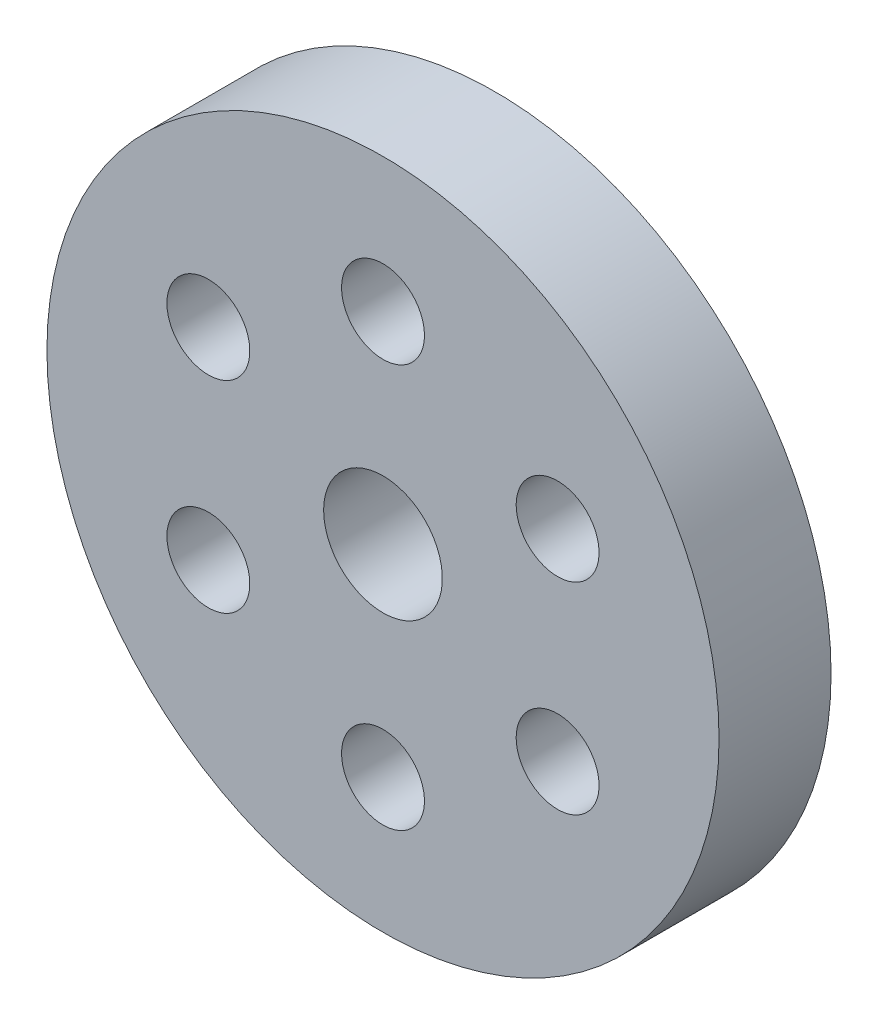
ISO-10303-21;
HEADER;
FILE_DESCRIPTION(('STEP AP214'),'2;1');
FILE_NAME('part.step','',(''),(''),'','','');
FILE_SCHEMA(('AUTOMOTIVE_DESIGN { 1 0 10303 214 1 1 1 1 }'));
ENDSEC;
DATA;
#1=APPLICATION_CONTEXT('core data for automotive mechanical design processes');
#2=APPLICATION_PROTOCOL_DEFINITION('international standard','automotive_design',2000,#1);
#3=PRODUCT_CONTEXT('',#1,'mechanical');
#4=PRODUCT('Part','Part','',(#3));
#5=PRODUCT_RELATED_PRODUCT_CATEGORY('part','',(#4));
#6=PRODUCT_DEFINITION_FORMATION('','',#4);
#7=PRODUCT_DEFINITION_CONTEXT('part definition',#1,'design');
#8=PRODUCT_DEFINITION('design','',#6,#7);
#9=PRODUCT_DEFINITION_SHAPE('','',#8);
#10=(LENGTH_UNIT() NAMED_UNIT(*) SI_UNIT(.MILLI.,.METRE.));
#11=(NAMED_UNIT(*) PLANE_ANGLE_UNIT() SI_UNIT($,.RADIAN.));
#12=(NAMED_UNIT(*) SI_UNIT($,.STERADIAN.) SOLID_ANGLE_UNIT());
#13=UNCERTAINTY_MEASURE_WITH_UNIT(LENGTH_MEASURE(1.E-05),#10,'distance_accuracy_value','');
#14=(GEOMETRIC_REPRESENTATION_CONTEXT(3) GLOBAL_UNCERTAINTY_ASSIGNED_CONTEXT((#13)) GLOBAL_UNIT_ASSIGNED_CONTEXT((#10,
#11,#12)) REPRESENTATION_CONTEXT('',''));
#15=CARTESIAN_POINT('',(0.,0.,0.));
#16=DIRECTION('',(0.,0.,1.));
#17=DIRECTION('',(1.,0.,0.));
#18=AXIS2_PLACEMENT_3D('',#15,#16,#17);
#19=CARTESIAN_POINT('',(0.,0.,0.));
#20=DIRECTION('',(0.,0.,1.));
#21=DIRECTION('',(1.,0.,0.));
#22=AXIS2_PLACEMENT_3D('',#19,#20,#21);
#23=PLANE('',#22);
#24=CARTESIAN_POINT('',(0.,-9.,0.));
#25=DIRECTION('',(0.,0.,-1.));
#26=DIRECTION('',(-1.,0.,0.));
#27=AXIS2_PLACEMENT_3D('',#24,#25,#26);
#28=CIRCLE('',#27,1.85);
#29=CARTESIAN_POINT('',(-1.85,-9.,0.));
#30=VERTEX_POINT('',#29);
#31=EDGE_CURVE('E71',#30,#30,#28,.T.);
#32=ORIENTED_EDGE('',*,*,#31,.F.);
#33=EDGE_LOOP('',(#32));
#34=FACE_BOUND('',#33,.T.);
#35=CARTESIAN_POINT('',(7.79422863405993,-4.50000000000004,0.));
#36=DIRECTION('',(0.,0.,-1.));
#37=DIRECTION('',(-1.,0.,0.));
#38=AXIS2_PLACEMENT_3D('',#35,#36,#37);
#39=CIRCLE('',#38,1.85);
#40=CARTESIAN_POINT('',(5.94422863405993,-4.50000000000004,0.));
#41=VERTEX_POINT('',#40);
#42=EDGE_CURVE('E65',#41,#41,#39,.T.);
#43=ORIENTED_EDGE('',*,*,#42,.F.);
#44=EDGE_LOOP('',(#43));
#45=FACE_BOUND('',#44,.T.);
#46=CARTESIAN_POINT('',(7.79422863405996,4.49999999999998,0.));
#47=DIRECTION('',(0.,0.,-1.));
#48=DIRECTION('',(-1.,0.,0.));
#49=AXIS2_PLACEMENT_3D('',#46,#47,#48);
#50=CIRCLE('',#49,1.85);
#51=CARTESIAN_POINT('',(5.94422863405996,4.49999999999998,0.));
#52=VERTEX_POINT('',#51);
#53=EDGE_CURVE('E59',#52,#52,#50,.T.);
#54=ORIENTED_EDGE('',*,*,#53,.F.);
#55=EDGE_LOOP('',(#54));
#56=FACE_BOUND('',#55,.T.);
#57=CARTESIAN_POINT('',(0.,9.,0.));
#58=DIRECTION('',(0.,0.,-1.));
#59=DIRECTION('',(-1.,0.,0.));
#60=AXIS2_PLACEMENT_3D('',#57,#58,#59);
#61=CIRCLE('',#60,1.85);
#62=CARTESIAN_POINT('',(-1.85,9.,0.));
#63=VERTEX_POINT('',#62);
#64=EDGE_CURVE('E53',#63,#63,#61,.T.);
#65=ORIENTED_EDGE('',*,*,#64,.F.);
#66=EDGE_LOOP('',(#65));
#67=FACE_BOUND('',#66,.T.);
#68=CARTESIAN_POINT('',(0.,0.,0.));
#69=DIRECTION('',(0.,0.,-1.));
#70=DIRECTION('',(-1.,0.,0.));
#71=AXIS2_PLACEMENT_3D('',#68,#69,#70);
#72=CIRCLE('',#71,2.65);
#73=CARTESIAN_POINT('',(-2.65,0.,0.));
#74=VERTEX_POINT('',#73);
#75=EDGE_CURVE('E47',#74,#74,#72,.T.);
#76=ORIENTED_EDGE('',*,*,#75,.F.);
#77=EDGE_LOOP('',(#76));
#78=FACE_BOUND('',#77,.T.);
#79=CARTESIAN_POINT('',(0.,0.,0.));
#80=DIRECTION('',(0.,0.,1.));
#81=DIRECTION('',(1.,0.,0.));
#82=AXIS2_PLACEMENT_3D('',#79,#80,#81);
#83=CIRCLE('',#82,15.);
#84=CARTESIAN_POINT('',(15.,0.,0.));
#85=VERTEX_POINT('',#84);
#86=EDGE_CURVE('E36',#85,#85,#83,.T.);
#87=ORIENTED_EDGE('',*,*,#86,.F.);
#88=EDGE_LOOP('',(#87));
#89=FACE_BOUND('',#88,.T.);
#90=CARTESIAN_POINT('',(-7.79422863405999,-4.49999999999993,0.));
#91=DIRECTION('',(0.,0.,-1.));
#92=DIRECTION('',(-1.,0.,0.));
#93=AXIS2_PLACEMENT_3D('',#90,#91,#92);
#94=CIRCLE('',#93,1.85);
#95=CARTESIAN_POINT('',(-9.64422863405999,-4.49999999999993,0.));
#96=VERTEX_POINT('',#95);
#97=EDGE_CURVE('E77',#96,#96,#94,.T.);
#98=ORIENTED_EDGE('',*,*,#97,.F.);
#99=EDGE_LOOP('',(#98));
#100=FACE_BOUND('',#99,.T.);
#101=CARTESIAN_POINT('',(-7.79422863405989,4.50000000000009,0.));
#102=DIRECTION('',(0.,0.,-1.));
#103=DIRECTION('',(-1.,0.,0.));
#104=AXIS2_PLACEMENT_3D('',#101,#102,#103);
#105=CIRCLE('',#104,1.85);
#106=CARTESIAN_POINT('',(-9.64422863405989,4.50000000000009,0.));
#107=VERTEX_POINT('',#106);
#108=EDGE_CURVE('E83',#107,#107,#105,.T.);
#109=ORIENTED_EDGE('',*,*,#108,.F.);
#110=EDGE_LOOP('',(#109));
#111=FACE_BOUND('',#110,.T.);
#112=ADVANCED_FACE('F32',(#34,#45,#56,#67,#78,#89,#100,#111),#23,.F.);
#113=CARTESIAN_POINT('',(0.,0.,5.));
#114=DIRECTION('',(0.,0.,1.));
#115=DIRECTION('',(1.,0.,0.));
#116=AXIS2_PLACEMENT_3D('',#113,#114,#115);
#117=PLANE('',#116);
#118=CARTESIAN_POINT('',(-7.79422863405989,4.50000000000009,5.));
#119=DIRECTION('',(0.,0.,-1.));
#120=DIRECTION('',(-1.,0.,0.));
#121=AXIS2_PLACEMENT_3D('',#118,#119,#120);
#122=CIRCLE('',#121,1.85);
#123=CARTESIAN_POINT('',(-9.64422863405989,4.50000000000009,5.));
#124=VERTEX_POINT('',#123);
#125=EDGE_CURVE('E80',#124,#124,#122,.T.);
#126=ORIENTED_EDGE('',*,*,#125,.T.);
#127=EDGE_LOOP('',(#126));
#128=FACE_BOUND('',#127,.T.);
#129=CARTESIAN_POINT('',(-7.79422863405999,-4.49999999999993,5.));
#130=DIRECTION('',(0.,0.,-1.));
#131=DIRECTION('',(-1.,0.,0.));
#132=AXIS2_PLACEMENT_3D('',#129,#130,#131);
#133=CIRCLE('',#132,1.85);
#134=CARTESIAN_POINT('',(-9.64422863405999,-4.49999999999993,5.));
#135=VERTEX_POINT('',#134);
#136=EDGE_CURVE('E74',#135,#135,#133,.T.);
#137=ORIENTED_EDGE('',*,*,#136,.T.);
#138=EDGE_LOOP('',(#137));
#139=FACE_BOUND('',#138,.T.);
#140=CARTESIAN_POINT('',(0.,-9.,5.));
#141=DIRECTION('',(0.,0.,-1.));
#142=DIRECTION('',(-1.,0.,0.));
#143=AXIS2_PLACEMENT_3D('',#140,#141,#142);
#144=CIRCLE('',#143,1.85);
#145=CARTESIAN_POINT('',(-1.85,-9.,5.));
#146=VERTEX_POINT('',#145);
#147=EDGE_CURVE('E68',#146,#146,#144,.T.);
#148=ORIENTED_EDGE('',*,*,#147,.T.);
#149=EDGE_LOOP('',(#148));
#150=FACE_BOUND('',#149,.T.);
#151=CARTESIAN_POINT('',(0.,0.,5.));
#152=DIRECTION('',(0.,0.,1.));
#153=DIRECTION('',(1.,0.,0.));
#154=AXIS2_PLACEMENT_3D('',#151,#152,#153);
#155=CIRCLE('',#154,15.);
#156=CARTESIAN_POINT('',(15.,0.,5.));
#157=VERTEX_POINT('',#156);
#158=EDGE_CURVE('E10',#157,#157,#155,.T.);
#159=ORIENTED_EDGE('',*,*,#158,.T.);
#160=EDGE_LOOP('',(#159));
#161=FACE_BOUND('',#160,.T.);
#162=CARTESIAN_POINT('',(0.,0.,5.));
#163=DIRECTION('',(0.,0.,-1.));
#164=DIRECTION('',(-1.,0.,0.));
#165=AXIS2_PLACEMENT_3D('',#162,#163,#164);
#166=CIRCLE('',#165,2.65);
#167=CARTESIAN_POINT('',(-2.65,0.,5.));
#168=VERTEX_POINT('',#167);
#169=EDGE_CURVE('E43',#168,#168,#166,.T.);
#170=ORIENTED_EDGE('',*,*,#169,.T.);
#171=EDGE_LOOP('',(#170));
#172=FACE_BOUND('',#171,.T.);
#173=CARTESIAN_POINT('',(0.,9.,5.));
#174=DIRECTION('',(0.,0.,-1.));
#175=DIRECTION('',(-1.,0.,0.));
#176=AXIS2_PLACEMENT_3D('',#173,#174,#175);
#177=CIRCLE('',#176,1.85);
#178=CARTESIAN_POINT('',(-1.85,9.,5.));
#179=VERTEX_POINT('',#178);
#180=EDGE_CURVE('E50',#179,#179,#177,.T.);
#181=ORIENTED_EDGE('',*,*,#180,.T.);
#182=EDGE_LOOP('',(#181));
#183=FACE_BOUND('',#182,.T.);
#184=CARTESIAN_POINT('',(7.79422863405996,4.49999999999998,5.));
#185=DIRECTION('',(0.,0.,-1.));
#186=DIRECTION('',(-1.,0.,0.));
#187=AXIS2_PLACEMENT_3D('',#184,#185,#186);
#188=CIRCLE('',#187,1.85);
#189=CARTESIAN_POINT('',(5.94422863405996,4.49999999999998,5.));
#190=VERTEX_POINT('',#189);
#191=EDGE_CURVE('E56',#190,#190,#188,.T.);
#192=ORIENTED_EDGE('',*,*,#191,.T.);
#193=EDGE_LOOP('',(#192));
#194=FACE_BOUND('',#193,.T.);
#195=CARTESIAN_POINT('',(7.79422863405993,-4.50000000000004,5.));
#196=DIRECTION('',(0.,0.,-1.));
#197=DIRECTION('',(-1.,0.,0.));
#198=AXIS2_PLACEMENT_3D('',#195,#196,#197);
#199=CIRCLE('',#198,1.85);
#200=CARTESIAN_POINT('',(5.94422863405993,-4.50000000000004,5.));
#201=VERTEX_POINT('',#200);
#202=EDGE_CURVE('E62',#201,#201,#199,.T.);
#203=ORIENTED_EDGE('',*,*,#202,.T.);
#204=EDGE_LOOP('',(#203));
#205=FACE_BOUND('',#204,.T.);
#206=ADVANCED_FACE('F90',(#128,#139,#150,#161,#172,#183,#194,#205),#117,.T.);
#207=CARTESIAN_POINT('',(0.,0.,5.));
#208=DIRECTION('',(0.,0.,-1.));
#209=DIRECTION('',(-1.,0.,0.));
#210=AXIS2_PLACEMENT_3D('',#207,#208,#209);
#211=CYLINDRICAL_SURFACE('',#210,15.);
#212=ORIENTED_EDGE('',*,*,#158,.F.);
#213=EDGE_LOOP('',(#212));
#214=FACE_BOUND('',#213,.T.);
#215=ORIENTED_EDGE('',*,*,#86,.T.);
#216=EDGE_LOOP('',(#215));
#217=FACE_BOUND('',#216,.T.);
#218=ADVANCED_FACE('F34',(#214,#217),#211,.T.);
#219=CARTESIAN_POINT('',(0.,0.,0.));
#220=DIRECTION('',(0.,0.,-1.));
#221=DIRECTION('',(-1.,0.,0.));
#222=AXIS2_PLACEMENT_3D('',#219,#220,#221);
#223=CYLINDRICAL_SURFACE('',#222,2.65);
#224=ORIENTED_EDGE('',*,*,#169,.F.);
#225=EDGE_LOOP('',(#224));
#226=FACE_BOUND('',#225,.T.);
#227=ORIENTED_EDGE('',*,*,#75,.T.);
#228=EDGE_LOOP('',(#227));
#229=FACE_BOUND('',#228,.T.);
#230=ADVANCED_FACE('F100',(#226,#229),#223,.F.);
#231=CARTESIAN_POINT('',(0.,9.,0.));
#232=DIRECTION('',(0.,0.,-1.));
#233=DIRECTION('',(-1.,0.,0.));
#234=AXIS2_PLACEMENT_3D('',#231,#232,#233);
#235=CYLINDRICAL_SURFACE('',#234,1.85);
#236=ORIENTED_EDGE('',*,*,#180,.F.);
#237=EDGE_LOOP('',(#236));
#238=FACE_BOUND('',#237,.T.);
#239=ORIENTED_EDGE('',*,*,#64,.T.);
#240=EDGE_LOOP('',(#239));
#241=FACE_BOUND('',#240,.T.);
#242=ADVANCED_FACE('F103',(#238,#241),#235,.F.);
#243=CARTESIAN_POINT('',(7.79422863405996,4.49999999999998,0.));
#244=DIRECTION('',(0.,0.,-1.));
#245=DIRECTION('',(-1.,0.,0.));
#246=AXIS2_PLACEMENT_3D('',#243,#244,#245);
#247=CYLINDRICAL_SURFACE('',#246,1.85);
#248=ORIENTED_EDGE('',*,*,#191,.F.);
#249=EDGE_LOOP('',(#248));
#250=FACE_BOUND('',#249,.T.);
#251=ORIENTED_EDGE('',*,*,#53,.T.);
#252=EDGE_LOOP('',(#251));
#253=FACE_BOUND('',#252,.T.);
#254=ADVANCED_FACE('F107',(#250,#253),#247,.F.);
#255=CARTESIAN_POINT('',(7.79422863405993,-4.50000000000004,0.));
#256=DIRECTION('',(0.,0.,-1.));
#257=DIRECTION('',(-1.,0.,0.));
#258=AXIS2_PLACEMENT_3D('',#255,#256,#257);
#259=CYLINDRICAL_SURFACE('',#258,1.85);
#260=ORIENTED_EDGE('',*,*,#202,.F.);
#261=EDGE_LOOP('',(#260));
#262=FACE_BOUND('',#261,.T.);
#263=ORIENTED_EDGE('',*,*,#42,.T.);
#264=EDGE_LOOP('',(#263));
#265=FACE_BOUND('',#264,.T.);
#266=ADVANCED_FACE('F111',(#262,#265),#259,.F.);
#267=CARTESIAN_POINT('',(0.,-9.,0.));
#268=DIRECTION('',(0.,0.,-1.));
#269=DIRECTION('',(-1.,0.,0.));
#270=AXIS2_PLACEMENT_3D('',#267,#268,#269);
#271=CYLINDRICAL_SURFACE('',#270,1.85);
#272=ORIENTED_EDGE('',*,*,#147,.F.);
#273=EDGE_LOOP('',(#272));
#274=FACE_BOUND('',#273,.T.);
#275=ORIENTED_EDGE('',*,*,#31,.T.);
#276=EDGE_LOOP('',(#275));
#277=FACE_BOUND('',#276,.T.);
#278=ADVANCED_FACE('F115',(#274,#277),#271,.F.);
#279=CARTESIAN_POINT('',(-7.79422863405999,-4.49999999999993,0.));
#280=DIRECTION('',(0.,0.,-1.));
#281=DIRECTION('',(-1.,0.,0.));
#282=AXIS2_PLACEMENT_3D('',#279,#280,#281);
#283=CYLINDRICAL_SURFACE('',#282,1.85);
#284=ORIENTED_EDGE('',*,*,#136,.F.);
#285=EDGE_LOOP('',(#284));
#286=FACE_BOUND('',#285,.T.);
#287=ORIENTED_EDGE('',*,*,#97,.T.);
#288=EDGE_LOOP('',(#287));
#289=FACE_BOUND('',#288,.T.);
#290=ADVANCED_FACE('F119',(#286,#289),#283,.F.);
#291=CARTESIAN_POINT('',(-7.79422863405989,4.50000000000009,0.));
#292=DIRECTION('',(0.,0.,-1.));
#293=DIRECTION('',(-1.,0.,0.));
#294=AXIS2_PLACEMENT_3D('',#291,#292,#293);
#295=CYLINDRICAL_SURFACE('',#294,1.85);
#296=ORIENTED_EDGE('',*,*,#125,.F.);
#297=EDGE_LOOP('',(#296));
#298=FACE_BOUND('',#297,.T.);
#299=ORIENTED_EDGE('',*,*,#108,.T.);
#300=EDGE_LOOP('',(#299));
#301=FACE_BOUND('',#300,.T.);
#302=ADVANCED_FACE('F87',(#298,#301),#295,.F.);
#303=CLOSED_SHELL('',(#112,#206,#218,#230,#242,#254,#266,#278,#290,#302));
#304=MANIFOLD_SOLID_BREP('B2',#303);
#305=ADVANCED_BREP_SHAPE_REPRESENTATION('',(#18,#304),#14);
#306=SHAPE_DEFINITION_REPRESENTATION(#9,#305);
ENDSEC;
END-ISO-10303-21;
